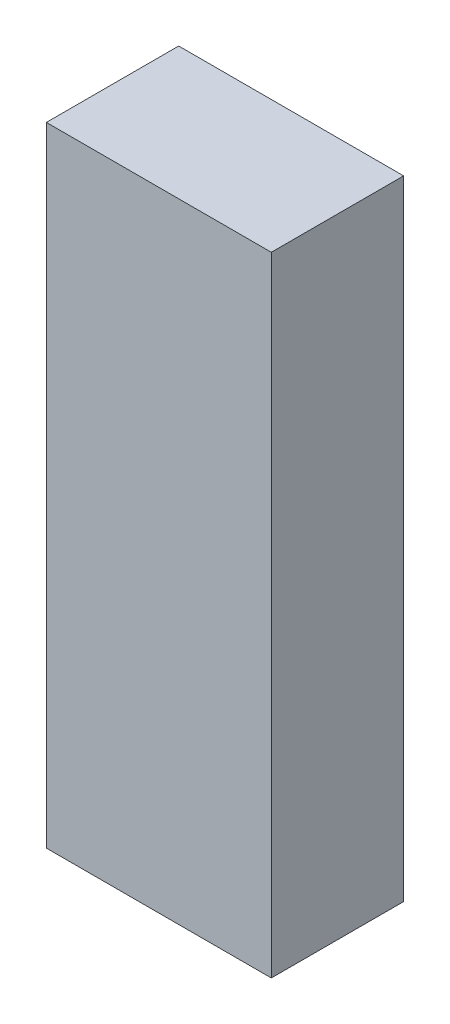
ISO-10303-21;
HEADER;
FILE_DESCRIPTION(('STEP AP214'),'2;1');
FILE_NAME('part.step','',(''),(''),'','','');
FILE_SCHEMA(('AUTOMOTIVE_DESIGN { 1 0 10303 214 1 1 1 1 }'));
ENDSEC;
DATA;
#1=APPLICATION_CONTEXT('core data for automotive mechanical design processes');
#2=APPLICATION_PROTOCOL_DEFINITION('international standard','automotive_design',2000,#1);
#3=PRODUCT_CONTEXT('',#1,'mechanical');
#4=PRODUCT('Part','Part','',(#3));
#5=PRODUCT_RELATED_PRODUCT_CATEGORY('part','',(#4));
#6=PRODUCT_DEFINITION_FORMATION('','',#4);
#7=PRODUCT_DEFINITION_CONTEXT('part definition',#1,'design');
#8=PRODUCT_DEFINITION('design','',#6,#7);
#9=PRODUCT_DEFINITION_SHAPE('','',#8);
#10=(LENGTH_UNIT() NAMED_UNIT(*) SI_UNIT(.MILLI.,.METRE.));
#11=(NAMED_UNIT(*) PLANE_ANGLE_UNIT() SI_UNIT($,.RADIAN.));
#12=(NAMED_UNIT(*) SI_UNIT($,.STERADIAN.) SOLID_ANGLE_UNIT());
#13=UNCERTAINTY_MEASURE_WITH_UNIT(LENGTH_MEASURE(1.E-05),#10,'distance_accuracy_value','');
#14=(GEOMETRIC_REPRESENTATION_CONTEXT(3) GLOBAL_UNCERTAINTY_ASSIGNED_CONTEXT((#13)) GLOBAL_UNIT_ASSIGNED_CONTEXT((#10,
#11,#12)) REPRESENTATION_CONTEXT('',''));
#15=CARTESIAN_POINT('',(0.,0.,0.));
#16=DIRECTION('',(0.,0.,1.));
#17=DIRECTION('',(1.,0.,0.));
#18=AXIS2_PLACEMENT_3D('',#15,#16,#17);
#19=CARTESIAN_POINT('',(0.,0.,20.));
#20=DIRECTION('',(0.,1.,0.));
#21=DIRECTION('',(0.,0.,1.));
#22=AXIS2_PLACEMENT_3D('',#19,#20,#21);
#23=PLANE('',#22);
#24=DIRECTION('',(1.,0.,0.));
#25=VECTOR('',#24,1.);
#26=CARTESIAN_POINT('',(0.,0.,0.));
#27=LINE('',#26,#25);
#28=CARTESIAN_POINT('',(-34.,0.,0.));
#29=VERTEX_POINT('',#28);
#30=CARTESIAN_POINT('',(0.,0.,0.));
#31=VERTEX_POINT('',#30);
#32=EDGE_CURVE('E104',#29,#31,#27,.T.);
#33=ORIENTED_EDGE('',*,*,#32,.T.);
#34=DIRECTION('',(0.,0.,-1.));
#35=VECTOR('',#34,1.);
#36=CARTESIAN_POINT('',(0.,0.,20.));
#37=LINE('',#36,#35);
#38=CARTESIAN_POINT('',(0.,0.,20.));
#39=VERTEX_POINT('',#38);
#40=EDGE_CURVE('E11',#39,#31,#37,.T.);
#41=ORIENTED_EDGE('',*,*,#40,.F.);
#42=DIRECTION('',(1.,0.,0.));
#43=VECTOR('',#42,1.);
#44=CARTESIAN_POINT('',(0.,0.,20.));
#45=LINE('',#44,#43);
#46=CARTESIAN_POINT('',(-34.,0.,20.));
#47=VERTEX_POINT('',#46);
#48=EDGE_CURVE('E92',#47,#39,#45,.T.);
#49=ORIENTED_EDGE('',*,*,#48,.F.);
#50=DIRECTION('',(0.,0.,-1.));
#51=VECTOR('',#50,1.);
#52=CARTESIAN_POINT('',(-34.,0.,20.));
#53=LINE('',#52,#51);
#54=EDGE_CURVE('E100',#47,#29,#53,.T.);
#55=ORIENTED_EDGE('',*,*,#54,.T.);
#56=EDGE_LOOP('',(#33,#41,#49,#55));
#57=FACE_BOUND('',#56,.T.);
#58=ADVANCED_FACE('F41',(#57),#23,.F.);
#59=CARTESIAN_POINT('',(0.,0.,20.));
#60=DIRECTION('',(-1.,0.,0.));
#61=DIRECTION('',(0.,0.,1.));
#62=AXIS2_PLACEMENT_3D('',#59,#60,#61);
#63=PLANE('',#62);
#64=DIRECTION('',(0.,1.,0.));
#65=VECTOR('',#64,1.);
#66=CARTESIAN_POINT('',(0.,0.,0.));
#67=LINE('',#66,#65);
#68=CARTESIAN_POINT('',(0.,95.,0.));
#69=VERTEX_POINT('',#68);
#70=EDGE_CURVE('E96',#31,#69,#67,.T.);
#71=ORIENTED_EDGE('',*,*,#70,.T.);
#72=DIRECTION('',(0.,0.,-1.));
#73=VECTOR('',#72,1.);
#74=CARTESIAN_POINT('',(0.,95.,20.));
#75=LINE('',#74,#73);
#76=CARTESIAN_POINT('',(0.,95.,20.));
#77=VERTEX_POINT('',#76);
#78=EDGE_CURVE('E49',#77,#69,#75,.T.);
#79=ORIENTED_EDGE('',*,*,#78,.F.);
#80=DIRECTION('',(0.,1.,0.));
#81=VECTOR('',#80,1.);
#82=CARTESIAN_POINT('',(0.,0.,20.));
#83=LINE('',#82,#81);
#84=EDGE_CURVE('E87',#39,#77,#83,.T.);
#85=ORIENTED_EDGE('',*,*,#84,.F.);
#86=ORIENTED_EDGE('',*,*,#40,.T.);
#87=EDGE_LOOP('',(#71,#79,#85,#86));
#88=FACE_BOUND('',#87,.T.);
#89=ADVANCED_FACE('F95',(#88),#63,.F.);
#90=CARTESIAN_POINT('',(0.,95.,20.));
#91=DIRECTION('',(0.,-1.,0.));
#92=DIRECTION('',(0.,0.,-1.));
#93=AXIS2_PLACEMENT_3D('',#90,#91,#92);
#94=PLANE('',#93);
#95=DIRECTION('',(-1.,0.,0.));
#96=VECTOR('',#95,1.);
#97=CARTESIAN_POINT('',(0.,95.,0.));
#98=LINE('',#97,#96);
#99=CARTESIAN_POINT('',(-34.,95.,0.));
#100=VERTEX_POINT('',#99);
#101=EDGE_CURVE('E74',#69,#100,#98,.T.);
#102=ORIENTED_EDGE('',*,*,#101,.T.);
#103=DIRECTION('',(0.,0.,-1.));
#104=VECTOR('',#103,1.);
#105=CARTESIAN_POINT('',(-34.,95.,20.));
#106=LINE('',#105,#104);
#107=CARTESIAN_POINT('',(-34.,95.,20.));
#108=VERTEX_POINT('',#107);
#109=EDGE_CURVE('E97',#108,#100,#106,.T.);
#110=ORIENTED_EDGE('',*,*,#109,.F.);
#111=DIRECTION('',(-1.,0.,0.));
#112=VECTOR('',#111,1.);
#113=CARTESIAN_POINT('',(0.,95.,20.));
#114=LINE('',#113,#112);
#115=EDGE_CURVE('E90',#77,#108,#114,.T.);
#116=ORIENTED_EDGE('',*,*,#115,.F.);
#117=ORIENTED_EDGE('',*,*,#78,.T.);
#118=EDGE_LOOP('',(#102,#110,#116,#117));
#119=FACE_BOUND('',#118,.T.);
#120=ADVANCED_FACE('F98',(#119),#94,.F.);
#121=CARTESIAN_POINT('',(-34.,0.,20.));
#122=DIRECTION('',(1.,0.,0.));
#123=DIRECTION('',(0.,0.,-1.));
#124=AXIS2_PLACEMENT_3D('',#121,#122,#123);
#125=PLANE('',#124);
#126=DIRECTION('',(0.,-1.,0.));
#127=VECTOR('',#126,1.);
#128=CARTESIAN_POINT('',(-34.,0.,0.));
#129=LINE('',#128,#127);
#130=EDGE_CURVE('E80',#100,#29,#129,.T.);
#131=ORIENTED_EDGE('',*,*,#130,.T.);
#132=ORIENTED_EDGE('',*,*,#54,.F.);
#133=DIRECTION('',(0.,-1.,0.));
#134=VECTOR('',#133,1.);
#135=CARTESIAN_POINT('',(-34.,0.,20.));
#136=LINE('',#135,#134);
#137=EDGE_CURVE('E57',#108,#47,#136,.T.);
#138=ORIENTED_EDGE('',*,*,#137,.F.);
#139=ORIENTED_EDGE('',*,*,#109,.T.);
#140=EDGE_LOOP('',(#131,#132,#138,#139));
#141=FACE_BOUND('',#140,.T.);
#142=ADVANCED_FACE('F111',(#141),#125,.F.);
#143=CARTESIAN_POINT('',(0.,0.,20.));
#144=DIRECTION('',(0.,0.,-1.));
#145=DIRECTION('',(-1.,0.,0.));
#146=AXIS2_PLACEMENT_3D('',#143,#144,#145);
#147=PLANE('',#146);
#148=ORIENTED_EDGE('',*,*,#48,.T.);
#149=ORIENTED_EDGE('',*,*,#84,.T.);
#150=ORIENTED_EDGE('',*,*,#115,.T.);
#151=ORIENTED_EDGE('',*,*,#137,.T.);
#152=EDGE_LOOP('',(#148,#149,#150,#151));
#153=FACE_BOUND('',#152,.T.);
#154=ADVANCED_FACE('F88',(#153),#147,.F.);
#155=CARTESIAN_POINT('',(0.,0.,0.));
#156=DIRECTION('',(0.,0.,-1.));
#157=DIRECTION('',(-1.,0.,0.));
#158=AXIS2_PLACEMENT_3D('',#155,#156,#157);
#159=PLANE('',#158);
#160=ORIENTED_EDGE('',*,*,#32,.F.);
#161=ORIENTED_EDGE('',*,*,#130,.F.);
#162=ORIENTED_EDGE('',*,*,#101,.F.);
#163=ORIENTED_EDGE('',*,*,#70,.F.);
#164=EDGE_LOOP('',(#160,#161,#162,#163));
#165=FACE_BOUND('',#164,.T.);
#166=ADVANCED_FACE('F114',(#165),#159,.T.);
#167=CLOSED_SHELL('',(#58,#89,#120,#142,#154,#166));
#168=MANIFOLD_SOLID_BREP('B2',#167);
#169=ADVANCED_BREP_SHAPE_REPRESENTATION('',(#18,#168),#14);
#170=SHAPE_DEFINITION_REPRESENTATION(#9,#169);
ENDSEC;
END-ISO-10303-21;
